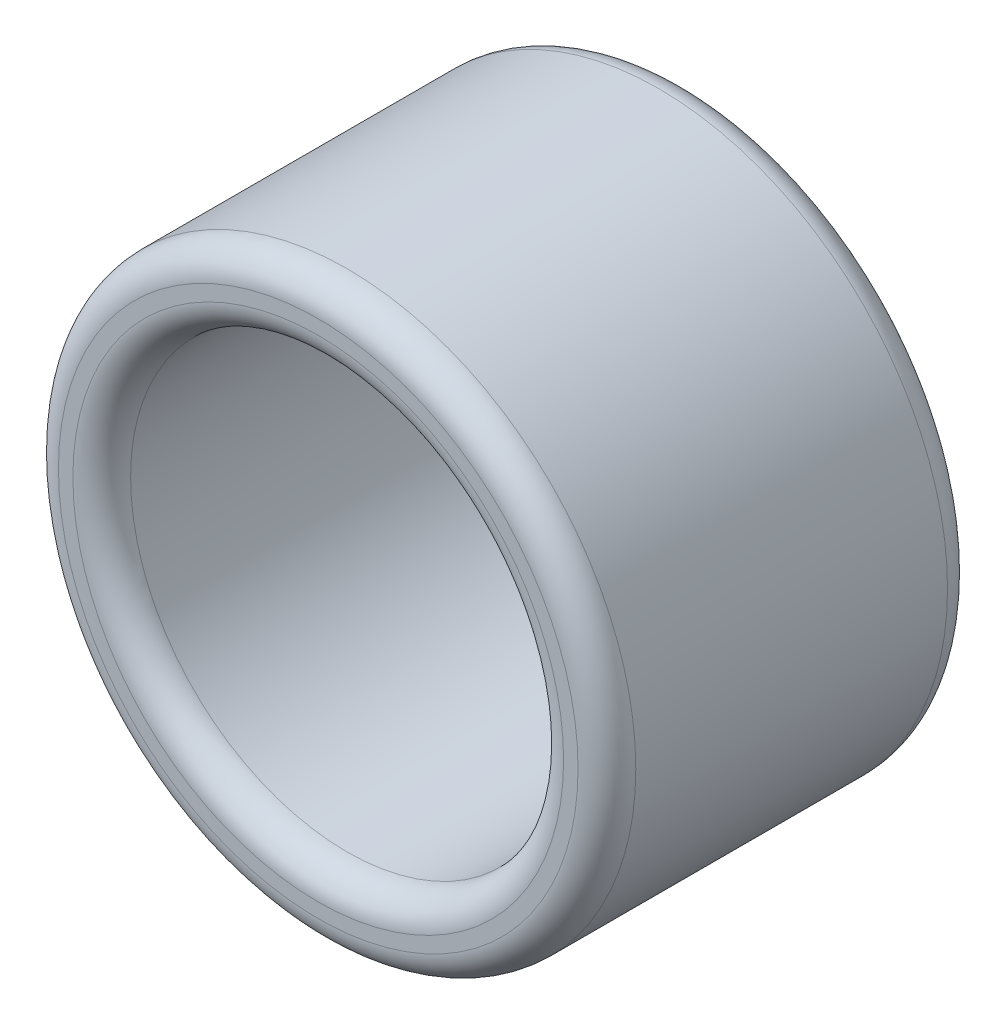
ISO-10303-21;
HEADER;
FILE_DESCRIPTION(('STEP AP214'),'2;1');
FILE_NAME('part.step','',(''),(''),'','','');
FILE_SCHEMA(('AUTOMOTIVE_DESIGN { 1 0 10303 214 1 1 1 1 }'));
ENDSEC;
DATA;
#1=APPLICATION_CONTEXT('core data for automotive mechanical design processes');
#2=APPLICATION_PROTOCOL_DEFINITION('international standard','automotive_design',2000,#1);
#3=PRODUCT_CONTEXT('',#1,'mechanical');
#4=PRODUCT('Part','Part','',(#3));
#5=PRODUCT_RELATED_PRODUCT_CATEGORY('part','',(#4));
#6=PRODUCT_DEFINITION_FORMATION('','',#4);
#7=PRODUCT_DEFINITION_CONTEXT('part definition',#1,'design');
#8=PRODUCT_DEFINITION('design','',#6,#7);
#9=PRODUCT_DEFINITION_SHAPE('','',#8);
#10=(LENGTH_UNIT() NAMED_UNIT(*) SI_UNIT(.MILLI.,.METRE.));
#11=(NAMED_UNIT(*) PLANE_ANGLE_UNIT() SI_UNIT($,.RADIAN.));
#12=(NAMED_UNIT(*) SI_UNIT($,.STERADIAN.) SOLID_ANGLE_UNIT());
#13=UNCERTAINTY_MEASURE_WITH_UNIT(LENGTH_MEASURE(1.E-05),#10,'distance_accuracy_value','');
#14=(GEOMETRIC_REPRESENTATION_CONTEXT(3) GLOBAL_UNCERTAINTY_ASSIGNED_CONTEXT((#13)) GLOBAL_UNIT_ASSIGNED_CONTEXT((#10,
#11,#12)) REPRESENTATION_CONTEXT('',''));
#15=CARTESIAN_POINT('',(0.,0.,0.));
#16=DIRECTION('',(0.,0.,1.));
#17=DIRECTION('',(1.,0.,0.));
#18=AXIS2_PLACEMENT_3D('',#15,#16,#17);
#19=CARTESIAN_POINT('',(0.,0.,2.56));
#20=DIRECTION('',(0.,0.,1.));
#21=DIRECTION('',(1.,0.,0.));
#22=AXIS2_PLACEMENT_3D('',#19,#20,#21);
#23=PLANE('',#22);
#24=CARTESIAN_POINT('',(0.,0.,2.56));
#25=DIRECTION('',(0.,0.,1.));
#26=DIRECTION('',(1.,0.,0.));
#27=AXIS2_PLACEMENT_3D('',#24,#25,#26);
#28=CIRCLE('',#27,1.7);
#29=CARTESIAN_POINT('',(1.7,0.,2.56));
#30=VERTEX_POINT('',#29);
#31=EDGE_CURVE('E10',#30,#30,#28,.F.);
#32=ORIENTED_EDGE('',*,*,#31,.T.);
#33=EDGE_LOOP('',(#32));
#34=FACE_BOUND('',#33,.T.);
#35=CARTESIAN_POINT('',(0.,0.,2.56));
#36=DIRECTION('',(0.,0.,1.));
#37=DIRECTION('',(1.,0.,0.));
#38=AXIS2_PLACEMENT_3D('',#35,#36,#37);
#39=CIRCLE('',#38,1.8);
#40=CARTESIAN_POINT('',(1.8,0.,2.56));
#41=VERTEX_POINT('',#40);
#42=EDGE_CURVE('E37',#41,#41,#39,.T.);
#43=ORIENTED_EDGE('',*,*,#42,.T.);
#44=EDGE_LOOP('',(#43));
#45=FACE_BOUND('',#44,.T.);
#46=ADVANCED_FACE('F30',(#34,#45),#23,.T.);
#47=CARTESIAN_POINT('',(0.,0.,0.));
#48=DIRECTION('',(0.,0.,1.));
#49=DIRECTION('',(1.,0.,0.));
#50=AXIS2_PLACEMENT_3D('',#47,#48,#49);
#51=PLANE('',#50);
#52=CARTESIAN_POINT('',(0.,0.,0.));
#53=DIRECTION('',(0.,0.,1.));
#54=DIRECTION('',(1.,0.,0.));
#55=AXIS2_PLACEMENT_3D('',#52,#53,#54);
#56=CIRCLE('',#55,1.7);
#57=CARTESIAN_POINT('',(1.7,0.,0.));
#58=VERTEX_POINT('',#57);
#59=EDGE_CURVE('E56',#58,#58,#56,.T.);
#60=ORIENTED_EDGE('',*,*,#59,.T.);
#61=EDGE_LOOP('',(#60));
#62=FACE_BOUND('',#61,.T.);
#63=CARTESIAN_POINT('',(0.,0.,0.));
#64=DIRECTION('',(0.,0.,1.));
#65=DIRECTION('',(1.,0.,0.));
#66=AXIS2_PLACEMENT_3D('',#63,#64,#65);
#67=CIRCLE('',#66,1.8);
#68=CARTESIAN_POINT('',(1.8,0.,0.));
#69=VERTEX_POINT('',#68);
#70=EDGE_CURVE('E59',#69,#69,#67,.F.);
#71=ORIENTED_EDGE('',*,*,#70,.T.);
#72=EDGE_LOOP('',(#71));
#73=FACE_BOUND('',#72,.T.);
#74=ADVANCED_FACE('F63',(#62,#73),#51,.F.);
#75=CARTESIAN_POINT('',(0.,0.,2.56));
#76=DIRECTION('',(0.,0.,-1.));
#77=DIRECTION('',(-1.,0.,0.));
#78=AXIS2_PLACEMENT_3D('',#75,#76,#77);
#79=CYLINDRICAL_SURFACE('',#78,2.);
#80=CARTESIAN_POINT('',(0.,0.,0.2));
#81=DIRECTION('',(0.,0.,1.));
#82=DIRECTION('',(1.,0.,0.));
#83=AXIS2_PLACEMENT_3D('',#80,#81,#82);
#84=CIRCLE('',#83,2.);
#85=CARTESIAN_POINT('',(-2.,0.,0.2));
#86=VERTEX_POINT('',#85);
#87=EDGE_CURVE('E41',#86,#86,#84,.T.);
#88=CARTESIAN_POINT('',(0.,0.,2.36));
#89=DIRECTION('',(0.,0.,1.));
#90=DIRECTION('',(1.,0.,0.));
#91=AXIS2_PLACEMENT_3D('',#88,#89,#90);
#92=CIRCLE('',#91,2.);
#93=CARTESIAN_POINT('',(-2.,0.,2.36));
#94=VERTEX_POINT('',#93);
#95=EDGE_CURVE('E45',#94,#94,#92,.F.);
#96=CARTESIAN_POINT('',(-2.,0.,0.2));
#97=CARTESIAN_POINT('',(-2.,0.,0.2225));
#98=CARTESIAN_POINT('',(-2.,0.,0.245));
#99=CARTESIAN_POINT('',(-2.,0.,0.29));
#100=CARTESIAN_POINT('',(-2.,0.,0.3125));
#101=CARTESIAN_POINT('',(-2.,0.,0.3575));
#102=CARTESIAN_POINT('',(-2.,0.,0.38));
#103=CARTESIAN_POINT('',(-2.,0.,0.425));
#104=CARTESIAN_POINT('',(-2.,0.,0.4475));
#105=CARTESIAN_POINT('',(-2.,0.,0.4925));
#106=CARTESIAN_POINT('',(-2.,0.,0.515));
#107=CARTESIAN_POINT('',(-2.,0.,0.56));
#108=CARTESIAN_POINT('',(-2.,0.,0.5825));
#109=CARTESIAN_POINT('',(-2.,0.,0.6275));
#110=CARTESIAN_POINT('',(-2.,0.,0.65));
#111=CARTESIAN_POINT('',(-2.,0.,0.695));
#112=CARTESIAN_POINT('',(-2.,0.,0.717499999999999));
#113=CARTESIAN_POINT('',(-2.,0.,0.7625));
#114=CARTESIAN_POINT('',(-2.,0.,0.785));
#115=CARTESIAN_POINT('',(-2.,0.,0.83));
#116=CARTESIAN_POINT('',(-2.,0.,0.8525));
#117=CARTESIAN_POINT('',(-2.,0.,0.8975));
#118=CARTESIAN_POINT('',(-2.,0.,0.92));
#119=CARTESIAN_POINT('',(-2.,0.,0.965));
#120=CARTESIAN_POINT('',(-2.,0.,0.9875));
#121=CARTESIAN_POINT('',(-2.,0.,1.0325));
#122=CARTESIAN_POINT('',(-2.,0.,1.055));
#123=CARTESIAN_POINT('',(-2.,0.,1.1));
#124=CARTESIAN_POINT('',(-2.,0.,1.1225));
#125=CARTESIAN_POINT('',(-2.,0.,1.1675));
#126=CARTESIAN_POINT('',(-2.,0.,1.19));
#127=CARTESIAN_POINT('',(-2.,0.,1.235));
#128=CARTESIAN_POINT('',(-2.,0.,1.2575));
#129=CARTESIAN_POINT('',(-2.,0.,1.3025));
#130=CARTESIAN_POINT('',(-2.,0.,1.325));
#131=CARTESIAN_POINT('',(-2.,0.,1.37));
#132=CARTESIAN_POINT('',(-2.,0.,1.3925));
#133=CARTESIAN_POINT('',(-2.,0.,1.4375));
#134=CARTESIAN_POINT('',(-2.,0.,1.46));
#135=CARTESIAN_POINT('',(-2.,0.,1.505));
#136=CARTESIAN_POINT('',(-2.,0.,1.5275));
#137=CARTESIAN_POINT('',(-2.,0.,1.5725));
#138=CARTESIAN_POINT('',(-2.,0.,1.595));
#139=CARTESIAN_POINT('',(-2.,0.,1.64));
#140=CARTESIAN_POINT('',(-2.,0.,1.6625));
#141=CARTESIAN_POINT('',(-2.,0.,1.7075));
#142=CARTESIAN_POINT('',(-2.,0.,1.73));
#143=CARTESIAN_POINT('',(-2.,0.,1.775));
#144=CARTESIAN_POINT('',(-2.,0.,1.7975));
#145=CARTESIAN_POINT('',(-2.,0.,1.8425));
#146=CARTESIAN_POINT('',(-2.,0.,1.865));
#147=CARTESIAN_POINT('',(-2.,0.,1.91));
#148=CARTESIAN_POINT('',(-2.,0.,1.9325));
#149=CARTESIAN_POINT('',(-2.,0.,1.9775));
#150=CARTESIAN_POINT('',(-2.,0.,2.));
#151=CARTESIAN_POINT('',(-2.,0.,2.045));
#152=CARTESIAN_POINT('',(-2.,0.,2.0675));
#153=CARTESIAN_POINT('',(-2.,0.,2.1125));
#154=CARTESIAN_POINT('',(-2.,0.,2.135));
#155=CARTESIAN_POINT('',(-2.,0.,2.18));
#156=CARTESIAN_POINT('',(-2.,0.,2.2025));
#157=CARTESIAN_POINT('',(-2.,0.,2.2475));
#158=CARTESIAN_POINT('',(-2.,0.,2.27));
#159=CARTESIAN_POINT('',(-2.,0.,2.315));
#160=CARTESIAN_POINT('',(-2.,0.,2.3375));
#161=CARTESIAN_POINT('',(-2.,0.,2.36));
#162=B_SPLINE_CURVE_WITH_KNOTS('',3,(#96,#97,#98,#99,#100,#101,#102,#103,#104,#105,#106,#107,
#108,#109,#110,#111,#112,#113,#114,#115,#116,#117,#118,#119,#120,#121,#122,#123,#124,#125,#126,
#127,#128,#129,#130,#131,#132,#133,#134,#135,#136,#137,#138,#139,#140,#141,#142,#143,#144,#145,
#146,#147,#148,#149,#150,#151,#152,#153,#154,#155,#156,#157,#158,#159,#160,#161),.UNSPECIFIED.,
.F.,.F.,(4,2,2,2,2,2,2,2,2,2,2,2,2,2,2,2,2,2,2,2,2,2,2,2,2,2,2,2,2,2,2,2,4),(0.,
0.0674999999999999,0.135,0.2025,0.27,0.3375,0.405,0.4725,0.54,0.6075,0.675,0.7425,0.81,0.8775,
0.945,1.0125,1.08,1.1475,1.215,1.2825,1.35,1.4175,1.485,1.5525,1.62,1.6875,1.755,1.8225,1.89,
1.9575,2.025,2.0925,2.16),.UNSPECIFIED.);
#163=EDGE_CURVE('BSEAM73',#86,#94,#162,.T.);
#164=ORIENTED_EDGE('',*,*,#87,.T.);
#165=ORIENTED_EDGE('',*,*,#95,.T.);
#166=ORIENTED_EDGE('',*,*,#163,.T.);
#167=ORIENTED_EDGE('',*,*,#163,.F.);
#168=EDGE_LOOP('',(#164,#166,#165,#167));
#169=FACE_BOUND('',#168,.T.);
#170=ADVANCED_FACE('F73',(#169),#79,.T.);
#171=CARTESIAN_POINT('',(0.,0.,2.56));
#172=DIRECTION('',(0.,0.,-1.));
#173=DIRECTION('',(-1.,0.,0.));
#174=AXIS2_PLACEMENT_3D('',#171,#172,#173);
#175=CYLINDRICAL_SURFACE('',#174,1.5);
#176=CARTESIAN_POINT('',(0.,0.,0.2));
#177=DIRECTION('',(0.,0.,1.));
#178=DIRECTION('',(1.,0.,0.));
#179=AXIS2_PLACEMENT_3D('',#176,#177,#178);
#180=CIRCLE('',#179,1.5);
#181=CARTESIAN_POINT('',(-1.5,0.,0.2));
#182=VERTEX_POINT('',#181);
#183=EDGE_CURVE('E50',#182,#182,#180,.F.);
#184=CARTESIAN_POINT('',(0.,0.,2.36));
#185=DIRECTION('',(0.,0.,1.));
#186=DIRECTION('',(1.,0.,0.));
#187=AXIS2_PLACEMENT_3D('',#184,#185,#186);
#188=CIRCLE('',#187,1.5);
#189=CARTESIAN_POINT('',(-1.5,0.,2.36));
#190=VERTEX_POINT('',#189);
#191=EDGE_CURVE('E53',#190,#190,#188,.T.);
#192=CARTESIAN_POINT('',(-1.5,0.,0.2));
#193=CARTESIAN_POINT('',(-1.5,0.,0.2225));
#194=CARTESIAN_POINT('',(-1.5,0.,0.245));
#195=CARTESIAN_POINT('',(-1.5,0.,0.29));
#196=CARTESIAN_POINT('',(-1.5,0.,0.3125));
#197=CARTESIAN_POINT('',(-1.5,0.,0.3575));
#198=CARTESIAN_POINT('',(-1.5,0.,0.38));
#199=CARTESIAN_POINT('',(-1.5,0.,0.425));
#200=CARTESIAN_POINT('',(-1.5,0.,0.4475));
#201=CARTESIAN_POINT('',(-1.5,0.,0.4925));
#202=CARTESIAN_POINT('',(-1.5,0.,0.515));
#203=CARTESIAN_POINT('',(-1.5,0.,0.56));
#204=CARTESIAN_POINT('',(-1.5,0.,0.5825));
#205=CARTESIAN_POINT('',(-1.5,0.,0.6275));
#206=CARTESIAN_POINT('',(-1.5,0.,0.65));
#207=CARTESIAN_POINT('',(-1.5,0.,0.695));
#208=CARTESIAN_POINT('',(-1.5,0.,0.717499999999999));
#209=CARTESIAN_POINT('',(-1.5,0.,0.7625));
#210=CARTESIAN_POINT('',(-1.5,0.,0.785));
#211=CARTESIAN_POINT('',(-1.5,0.,0.83));
#212=CARTESIAN_POINT('',(-1.5,0.,0.8525));
#213=CARTESIAN_POINT('',(-1.5,0.,0.8975));
#214=CARTESIAN_POINT('',(-1.5,0.,0.92));
#215=CARTESIAN_POINT('',(-1.5,0.,0.965));
#216=CARTESIAN_POINT('',(-1.5,0.,0.9875));
#217=CARTESIAN_POINT('',(-1.5,0.,1.0325));
#218=CARTESIAN_POINT('',(-1.5,0.,1.055));
#219=CARTESIAN_POINT('',(-1.5,0.,1.1));
#220=CARTESIAN_POINT('',(-1.5,0.,1.1225));
#221=CARTESIAN_POINT('',(-1.5,0.,1.1675));
#222=CARTESIAN_POINT('',(-1.5,0.,1.19));
#223=CARTESIAN_POINT('',(-1.5,0.,1.235));
#224=CARTESIAN_POINT('',(-1.5,0.,1.2575));
#225=CARTESIAN_POINT('',(-1.5,0.,1.3025));
#226=CARTESIAN_POINT('',(-1.5,0.,1.325));
#227=CARTESIAN_POINT('',(-1.5,0.,1.37));
#228=CARTESIAN_POINT('',(-1.5,0.,1.3925));
#229=CARTESIAN_POINT('',(-1.5,0.,1.4375));
#230=CARTESIAN_POINT('',(-1.5,0.,1.46));
#231=CARTESIAN_POINT('',(-1.5,0.,1.505));
#232=CARTESIAN_POINT('',(-1.5,0.,1.5275));
#233=CARTESIAN_POINT('',(-1.5,0.,1.5725));
#234=CARTESIAN_POINT('',(-1.5,0.,1.595));
#235=CARTESIAN_POINT('',(-1.5,0.,1.64));
#236=CARTESIAN_POINT('',(-1.5,0.,1.6625));
#237=CARTESIAN_POINT('',(-1.5,0.,1.7075));
#238=CARTESIAN_POINT('',(-1.5,0.,1.73));
#239=CARTESIAN_POINT('',(-1.5,0.,1.775));
#240=CARTESIAN_POINT('',(-1.5,0.,1.7975));
#241=CARTESIAN_POINT('',(-1.5,0.,1.8425));
#242=CARTESIAN_POINT('',(-1.5,0.,1.865));
#243=CARTESIAN_POINT('',(-1.5,0.,1.91));
#244=CARTESIAN_POINT('',(-1.5,0.,1.9325));
#245=CARTESIAN_POINT('',(-1.5,0.,1.9775));
#246=CARTESIAN_POINT('',(-1.5,0.,2.));
#247=CARTESIAN_POINT('',(-1.5,0.,2.045));
#248=CARTESIAN_POINT('',(-1.5,0.,2.0675));
#249=CARTESIAN_POINT('',(-1.5,0.,2.1125));
#250=CARTESIAN_POINT('',(-1.5,0.,2.135));
#251=CARTESIAN_POINT('',(-1.5,0.,2.18));
#252=CARTESIAN_POINT('',(-1.5,0.,2.2025));
#253=CARTESIAN_POINT('',(-1.5,0.,2.2475));
#254=CARTESIAN_POINT('',(-1.5,0.,2.27));
#255=CARTESIAN_POINT('',(-1.5,0.,2.315));
#256=CARTESIAN_POINT('',(-1.5,0.,2.3375));
#257=CARTESIAN_POINT('',(-1.5,0.,2.36));
#258=B_SPLINE_CURVE_WITH_KNOTS('',3,(#192,#193,#194,#195,#196,#197,#198,#199,#200,#201,#202,
#203,#204,#205,#206,#207,#208,#209,#210,#211,#212,#213,#214,#215,#216,#217,#218,#219,#220,#221,
#222,#223,#224,#225,#226,#227,#228,#229,#230,#231,#232,#233,#234,#235,#236,#237,#238,#239,#240,
#241,#242,#243,#244,#245,#246,#247,#248,#249,#250,#251,#252,#253,#254,#255,#256,#257),
.UNSPECIFIED.,.F.,.F.,(4,2,2,2,2,2,2,2,2,2,2,2,2,2,2,2,2,2,2,2,2,2,2,2,2,2,2,2,2,2,2,2,4),(0.,
0.0674999999999999,0.135,0.2025,0.27,0.3375,0.405,0.4725,0.54,0.6075,0.675,0.7425,0.81,0.8775,
0.945,1.0125,1.08,1.1475,1.215,1.2825,1.35,1.4175,1.485,1.5525,1.62,1.6875,1.755,1.8225,1.89,
1.9575,2.025,2.0925,2.16),.UNSPECIFIED.);
#259=EDGE_CURVE('BSEAM76',#182,#190,#258,.T.);
#260=ORIENTED_EDGE('',*,*,#183,.T.);
#261=ORIENTED_EDGE('',*,*,#191,.T.);
#262=ORIENTED_EDGE('',*,*,#259,.T.);
#263=ORIENTED_EDGE('',*,*,#259,.F.);
#264=EDGE_LOOP('',(#260,#262,#261,#263));
#265=FACE_BOUND('',#264,.T.);
#266=ADVANCED_FACE('F76',(#265),#175,.F.);
#267=CARTESIAN_POINT('',(0.,0.,0.2));
#268=DIRECTION('',(0.,0.,1.));
#269=DIRECTION('',(1.,0.,0.));
#270=AXIS2_PLACEMENT_3D('',#267,#268,#269);
#271=TOROIDAL_SURFACE('',#270,1.7,0.2);
#272=ORIENTED_EDGE('',*,*,#183,.F.);
#273=EDGE_LOOP('',(#272));
#274=FACE_BOUND('',#273,.T.);
#275=ORIENTED_EDGE('',*,*,#59,.F.);
#276=EDGE_LOOP('',(#275));
#277=FACE_BOUND('',#276,.T.);
#278=ADVANCED_FACE('F69',(#274,#277),#271,.T.);
#279=CARTESIAN_POINT('',(0.,0.,0.2));
#280=DIRECTION('',(0.,0.,1.));
#281=DIRECTION('',(1.,0.,0.));
#282=AXIS2_PLACEMENT_3D('',#279,#280,#281);
#283=TOROIDAL_SURFACE('',#282,1.8,0.2);
#284=ORIENTED_EDGE('',*,*,#70,.F.);
#285=EDGE_LOOP('',(#284));
#286=FACE_BOUND('',#285,.T.);
#287=ORIENTED_EDGE('',*,*,#87,.F.);
#288=EDGE_LOOP('',(#287));
#289=FACE_BOUND('',#288,.T.);
#290=ADVANCED_FACE('F65',(#286,#289),#283,.T.);
#291=CARTESIAN_POINT('',(0.,0.,2.36));
#292=DIRECTION('',(0.,0.,1.));
#293=DIRECTION('',(1.,0.,0.));
#294=AXIS2_PLACEMENT_3D('',#291,#292,#293);
#295=TOROIDAL_SURFACE('',#294,1.7,0.2);
#296=ORIENTED_EDGE('',*,*,#31,.F.);
#297=EDGE_LOOP('',(#296));
#298=FACE_BOUND('',#297,.T.);
#299=ORIENTED_EDGE('',*,*,#191,.F.);
#300=EDGE_LOOP('',(#299));
#301=FACE_BOUND('',#300,.T.);
#302=ADVANCED_FACE('F68',(#298,#301),#295,.T.);
#303=CARTESIAN_POINT('',(0.,0.,2.36));
#304=DIRECTION('',(0.,0.,1.));
#305=DIRECTION('',(1.,0.,0.));
#306=AXIS2_PLACEMENT_3D('',#303,#304,#305);
#307=TOROIDAL_SURFACE('',#306,1.8,0.2);
#308=ORIENTED_EDGE('',*,*,#95,.F.);
#309=EDGE_LOOP('',(#308));
#310=FACE_BOUND('',#309,.T.);
#311=ORIENTED_EDGE('',*,*,#42,.F.);
#312=EDGE_LOOP('',(#311));
#313=FACE_BOUND('',#312,.T.);
#314=ADVANCED_FACE('F32',(#310,#313),#307,.T.);
#315=CLOSED_SHELL('',(#46,#74,#170,#266,#278,#290,#302,#314));
#316=MANIFOLD_SOLID_BREP('B2',#315);
#317=ADVANCED_BREP_SHAPE_REPRESENTATION('',(#18,#316),#14);
#318=SHAPE_DEFINITION_REPRESENTATION(#9,#317);
ENDSEC;
END-ISO-10303-21;
